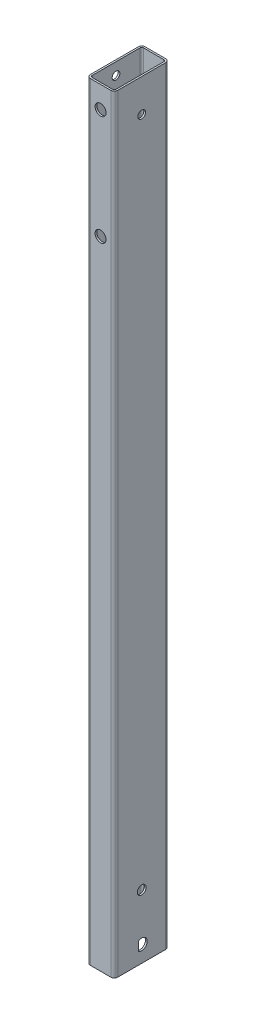
ISO-10303-21;
HEADER;
FILE_DESCRIPTION(('STEP AP214'),'2;1');
FILE_NAME('part.step','',(''),(''),'','','');
FILE_SCHEMA(('AUTOMOTIVE_DESIGN { 1 0 10303 214 1 1 1 1 }'));
ENDSEC;
DATA;
#1=APPLICATION_CONTEXT('core data for automotive mechanical design processes');
#2=APPLICATION_PROTOCOL_DEFINITION('international standard','automotive_design',2000,#1);
#3=PRODUCT_CONTEXT('',#1,'mechanical');
#4=PRODUCT('Part','Part','',(#3));
#5=PRODUCT_RELATED_PRODUCT_CATEGORY('part','',(#4));
#6=PRODUCT_DEFINITION_FORMATION('','',#4);
#7=PRODUCT_DEFINITION_CONTEXT('part definition',#1,'design');
#8=PRODUCT_DEFINITION('design','',#6,#7);
#9=PRODUCT_DEFINITION_SHAPE('','',#8);
#10=(LENGTH_UNIT() NAMED_UNIT(*) SI_UNIT(.MILLI.,.METRE.));
#11=(NAMED_UNIT(*) PLANE_ANGLE_UNIT() SI_UNIT($,.RADIAN.));
#12=(NAMED_UNIT(*) SI_UNIT($,.STERADIAN.) SOLID_ANGLE_UNIT());
#13=UNCERTAINTY_MEASURE_WITH_UNIT(LENGTH_MEASURE(1.E-05),#10,'distance_accuracy_value','');
#14=(GEOMETRIC_REPRESENTATION_CONTEXT(3) GLOBAL_UNCERTAINTY_ASSIGNED_CONTEXT((#13)) GLOBAL_UNIT_ASSIGNED_CONTEXT((#10,
#11,#12)) REPRESENTATION_CONTEXT('',''));
#15=CARTESIAN_POINT('',(0.,0.,0.));
#16=DIRECTION('',(0.,0.,1.));
#17=DIRECTION('',(1.,0.,0.));
#18=AXIS2_PLACEMENT_3D('',#15,#16,#17);
#19=CARTESIAN_POINT('',(12.5,0.,0.));
#20=DIRECTION('',(-1.,0.,0.));
#21=DIRECTION('',(0.,0.,-1.));
#22=AXIS2_PLACEMENT_3D('',#19,#20,#21);
#23=CYLINDRICAL_SURFACE('',#22,5.);
#24=CARTESIAN_POINT('',(-10.9,0.,0.));
#25=DIRECTION('',(1.,0.,0.));
#26=DIRECTION('',(0.,0.,-1.));
#27=AXIS2_PLACEMENT_3D('',#24,#25,#26);
#28=CIRCLE('',#27,5.);
#29=CARTESIAN_POINT('',(-10.9,-4.33012701892219,2.5));
#30=VERTEX_POINT('',#29);
#31=CARTESIAN_POINT('',(-10.9,4.33012701892219,2.5));
#32=VERTEX_POINT('',#31);
#33=EDGE_CURVE('E284',#30,#32,#28,.T.);
#34=ORIENTED_EDGE('',*,*,#33,.T.);
#35=DIRECTION('',(-1.,0.,0.));
#36=VECTOR('',#35,1.);
#37=CARTESIAN_POINT('',(12.5,4.33012701892219,2.5));
#38=LINE('',#37,#36);
#39=CARTESIAN_POINT('',(-12.5,4.33012701892219,2.5));
#40=VERTEX_POINT('',#39);
#41=EDGE_CURVE('E334',#40,#32,#38,.F.);
#42=ORIENTED_EDGE('',*,*,#41,.F.);
#43=CARTESIAN_POINT('',(-12.5,0.,0.));
#44=DIRECTION('',(-1.,0.,0.));
#45=DIRECTION('',(0.,0.,1.));
#46=AXIS2_PLACEMENT_3D('',#43,#44,#45);
#47=CIRCLE('',#46,5.);
#48=CARTESIAN_POINT('',(-12.5,-4.33012701892219,2.5));
#49=VERTEX_POINT('',#48);
#50=EDGE_CURVE('E295',#40,#49,#47,.T.);
#51=ORIENTED_EDGE('',*,*,#50,.T.);
#52=DIRECTION('',(-1.,0.,0.));
#53=VECTOR('',#52,1.);
#54=CARTESIAN_POINT('',(12.5,-4.33012701892219,2.5));
#55=LINE('',#54,#53);
#56=EDGE_CURVE('E337',#30,#49,#55,.T.);
#57=ORIENTED_EDGE('',*,*,#56,.F.);
#58=EDGE_LOOP('',(#34,#42,#51,#57));
#59=FACE_BOUND('',#58,.T.);
#60=ADVANCED_FACE('F41',(#59),#23,.F.);
#61=CARTESIAN_POINT('',(-20.7462112512353,4.,3.));
#62=DIRECTION('',(0.,0.,-1.));
#63=DIRECTION('',(1.,0.,0.));
#64=AXIS2_PLACEMENT_3D('',#61,#62,#63);
#65=PLANE('',#64);
#66=DIRECTION('',(0.,-1.,0.));
#67=VECTOR('',#66,1.);
#68=CARTESIAN_POINT('',(-10.9,4.,3.));
#69=LINE('',#68,#67);
#70=CARTESIAN_POINT('',(-10.9,3.46410161513775,3.));
#71=VERTEX_POINT('',#70);
#72=CARTESIAN_POINT('',(-10.9,-3.46410161513775,3.));
#73=VERTEX_POINT('',#72);
#74=EDGE_CURVE('E281',#71,#73,#69,.T.);
#75=ORIENTED_EDGE('',*,*,#74,.T.);
#76=DIRECTION('',(1.,0.,0.));
#77=VECTOR('',#76,1.);
#78=CARTESIAN_POINT('',(12.5,-3.46410161513775,3.));
#79=LINE('',#78,#77);
#80=CARTESIAN_POINT('',(-12.5,-3.46410161513775,3.));
#81=VERTEX_POINT('',#80);
#82=EDGE_CURVE('E330',#81,#73,#79,.T.);
#83=ORIENTED_EDGE('',*,*,#82,.F.);
#84=DIRECTION('',(0.,-1.,0.));
#85=VECTOR('',#84,1.);
#86=CARTESIAN_POINT('',(-12.5,4.,3.));
#87=LINE('',#86,#85);
#88=CARTESIAN_POINT('',(-12.5,3.46410161513775,3.));
#89=VERTEX_POINT('',#88);
#90=EDGE_CURVE('E292',#89,#81,#87,.T.);
#91=ORIENTED_EDGE('',*,*,#90,.F.);
#92=DIRECTION('',(1.,0.,0.));
#93=VECTOR('',#92,1.);
#94=CARTESIAN_POINT('',(-12.5,3.46410161513775,3.));
#95=LINE('',#94,#93);
#96=EDGE_CURVE('E325',#71,#89,#95,.F.);
#97=ORIENTED_EDGE('',*,*,#96,.F.);
#98=EDGE_LOOP('',(#75,#83,#91,#97));
#99=FACE_BOUND('',#98,.T.);
#100=ADVANCED_FACE('F429',(#99),#65,.T.);
#101=CARTESIAN_POINT('',(12.5,-3.46410161513775,2.));
#102=DIRECTION('',(-1.,0.,0.));
#103=DIRECTION('',(0.,0.,-1.));
#104=AXIS2_PLACEMENT_3D('',#101,#102,#103);
#105=CYLINDRICAL_SURFACE('',#104,1.);
#106=ORIENTED_EDGE('',*,*,#56,.T.);
#107=CARTESIAN_POINT('',(-12.5,-3.46410161513775,2.));
#108=DIRECTION('',(1.,0.,0.));
#109=DIRECTION('',(0.,0.,-1.));
#110=AXIS2_PLACEMENT_3D('',#107,#108,#109);
#111=CIRCLE('',#110,1.);
#112=EDGE_CURVE('E344',#49,#81,#111,.F.);
#113=ORIENTED_EDGE('',*,*,#112,.T.);
#114=ORIENTED_EDGE('',*,*,#82,.T.);
#115=CARTESIAN_POINT('',(-10.9,-3.46410161513775,2.));
#116=DIRECTION('',(1.,0.,0.));
#117=DIRECTION('',(0.,0.,-1.));
#118=AXIS2_PLACEMENT_3D('',#115,#116,#117);
#119=CIRCLE('',#118,1.);
#120=EDGE_CURVE('E287',#30,#73,#119,.F.);
#121=ORIENTED_EDGE('',*,*,#120,.F.);
#122=EDGE_LOOP('',(#106,#113,#114,#121));
#123=FACE_BOUND('',#122,.T.);
#124=ADVANCED_FACE('F422',(#123),#105,.F.);
#125=CARTESIAN_POINT('',(12.5,3.46410161513775,2.));
#126=DIRECTION('',(-1.,0.,0.));
#127=DIRECTION('',(0.,0.,-1.));
#128=AXIS2_PLACEMENT_3D('',#125,#126,#127);
#129=CYLINDRICAL_SURFACE('',#128,1.);
#130=ORIENTED_EDGE('',*,*,#96,.T.);
#131=CARTESIAN_POINT('',(-12.5,3.46410161513775,2.));
#132=DIRECTION('',(1.,0.,0.));
#133=DIRECTION('',(0.,0.,-1.));
#134=AXIS2_PLACEMENT_3D('',#131,#132,#133);
#135=CIRCLE('',#134,1.);
#136=EDGE_CURVE('E349',#89,#40,#135,.F.);
#137=ORIENTED_EDGE('',*,*,#136,.T.);
#138=ORIENTED_EDGE('',*,*,#41,.T.);
#139=CARTESIAN_POINT('',(-10.9,3.46410161513775,2.));
#140=DIRECTION('',(1.,0.,0.));
#141=DIRECTION('',(0.,0.,-1.));
#142=AXIS2_PLACEMENT_3D('',#139,#140,#141);
#143=CIRCLE('',#142,1.);
#144=EDGE_CURVE('E11',#71,#32,#143,.F.);
#145=ORIENTED_EDGE('',*,*,#144,.F.);
#146=EDGE_LOOP('',(#130,#137,#138,#145));
#147=FACE_BOUND('',#146,.T.);
#148=ADVANCED_FACE('F412',(#147),#129,.F.);
#149=CARTESIAN_POINT('',(12.5,0.,0.));
#150=DIRECTION('',(-1.,0.,0.));
#151=DIRECTION('',(0.,0.,-1.));
#152=AXIS2_PLACEMENT_3D('',#149,#150,#151);
#153=PLANE('',#152);
#154=CARTESIAN_POINT('',(12.5,655.,0.));
#155=DIRECTION('',(-1.,0.,0.));
#156=DIRECTION('',(0.,0.,1.));
#157=AXIS2_PLACEMENT_3D('',#154,#155,#156);
#158=CIRCLE('',#157,3.5);
#159=CARTESIAN_POINT('',(12.5,655.,3.5));
#160=VERTEX_POINT('',#159);
#161=EDGE_CURVE('E778',#160,#160,#158,.T.);
#162=ORIENTED_EDGE('',*,*,#161,.T.);
#163=EDGE_LOOP('',(#162));
#164=FACE_BOUND('',#163,.T.);
#165=CARTESIAN_POINT('',(12.5,43.,0.));
#166=DIRECTION('',(-1.,0.,0.));
#167=DIRECTION('',(0.,0.,1.));
#168=AXIS2_PLACEMENT_3D('',#165,#166,#167);
#169=CIRCLE('',#168,4.);
#170=CARTESIAN_POINT('',(12.5,43.,4.));
#171=VERTEX_POINT('',#170);
#172=EDGE_CURVE('E242',#171,#171,#169,.T.);
#173=ORIENTED_EDGE('',*,*,#172,.T.);
#174=EDGE_LOOP('',(#173));
#175=FACE_BOUND('',#174,.T.);
#176=DIRECTION('',(0.,0.,1.));
#177=VECTOR('',#176,1.);
#178=CARTESIAN_POINT('',(12.5,-15.,-25.));
#179=LINE('',#178,#177);
#180=CARTESIAN_POINT('',(12.5,-15.,-21.8));
#181=VERTEX_POINT('',#180);
#182=CARTESIAN_POINT('',(12.5,-15.,21.8));
#183=VERTEX_POINT('',#182);
#184=EDGE_CURVE('E305',#181,#183,#179,.T.);
#185=ORIENTED_EDGE('',*,*,#184,.F.);
#186=DIRECTION('',(0.,-1.,0.));
#187=VECTOR('',#186,1.);
#188=CARTESIAN_POINT('',(12.5,0.,-21.8));
#189=LINE('',#188,#187);
#190=CARTESIAN_POINT('',(12.5,685.,-21.8));
#191=VERTEX_POINT('',#190);
#192=EDGE_CURVE('E351',#191,#181,#189,.T.);
#193=ORIENTED_EDGE('',*,*,#192,.F.);
#194=DIRECTION('',(0.,0.,-1.));
#195=VECTOR('',#194,1.);
#196=CARTESIAN_POINT('',(12.5,685.,-25.));
#197=LINE('',#196,#195);
#198=CARTESIAN_POINT('',(12.5,685.,21.8));
#199=VERTEX_POINT('',#198);
#200=EDGE_CURVE('E302',#199,#191,#197,.T.);
#201=ORIENTED_EDGE('',*,*,#200,.F.);
#202=DIRECTION('',(0.,1.,0.));
#203=VECTOR('',#202,1.);
#204=CARTESIAN_POINT('',(12.5,0.,21.8));
#205=LINE('',#204,#203);
#206=EDGE_CURVE('E354',#183,#199,#205,.T.);
#207=ORIENTED_EDGE('',*,*,#206,.F.);
#208=EDGE_LOOP('',(#185,#193,#201,#207));
#209=FACE_BOUND('',#208,.T.);
#210=CARTESIAN_POINT('',(12.5,0.,0.));
#211=DIRECTION('',(-1.,0.,0.));
#212=DIRECTION('',(0.,0.,1.));
#213=AXIS2_PLACEMENT_3D('',#210,#211,#212);
#214=CIRCLE('',#213,5.);
#215=CARTESIAN_POINT('',(12.5,4.33012701892219,2.5));
#216=VERTEX_POINT('',#215);
#217=CARTESIAN_POINT('',(12.5,-4.33012701892219,2.5));
#218=VERTEX_POINT('',#217);
#219=EDGE_CURVE('E296',#216,#218,#214,.T.);
#220=ORIENTED_EDGE('',*,*,#219,.T.);
#221=CARTESIAN_POINT('',(12.5,-3.46410161513775,2.));
#222=DIRECTION('',(1.,0.,0.));
#223=DIRECTION('',(0.,0.,-1.));
#224=AXIS2_PLACEMENT_3D('',#221,#222,#223);
#225=CIRCLE('',#224,1.);
#226=CARTESIAN_POINT('',(12.5,-3.46410161513775,3.));
#227=VERTEX_POINT('',#226);
#228=EDGE_CURVE('E341',#227,#218,#225,.T.);
#229=ORIENTED_EDGE('',*,*,#228,.F.);
#230=DIRECTION('',(0.,-1.,0.));
#231=VECTOR('',#230,1.);
#232=CARTESIAN_POINT('',(12.5,4.,3.));
#233=LINE('',#232,#231);
#234=CARTESIAN_POINT('',(12.5,3.46410161513775,3.));
#235=VERTEX_POINT('',#234);
#236=EDGE_CURVE('E289',#235,#227,#233,.T.);
#237=ORIENTED_EDGE('',*,*,#236,.F.);
#238=CARTESIAN_POINT('',(12.5,3.46410161513775,2.));
#239=DIRECTION('',(1.,0.,0.));
#240=DIRECTION('',(0.,0.,-1.));
#241=AXIS2_PLACEMENT_3D('',#238,#239,#240);
#242=CIRCLE('',#241,1.);
#243=EDGE_CURVE('E346',#216,#235,#242,.T.);
#244=ORIENTED_EDGE('',*,*,#243,.F.);
#245=EDGE_LOOP('',(#220,#229,#237,#244));
#246=FACE_BOUND('',#245,.T.);
#247=ADVANCED_FACE('F409',(#164,#175,#209,#246),#153,.F.);
#248=CARTESIAN_POINT('',(-12.5,0.,0.));
#249=DIRECTION('',(-1.,0.,0.));
#250=DIRECTION('',(0.,0.,-1.));
#251=AXIS2_PLACEMENT_3D('',#248,#249,#250);
#252=PLANE('',#251);
#253=CARTESIAN_POINT('',(-12.5,674.,0.));
#254=DIRECTION('',(1.,0.,0.));
#255=DIRECTION('',(0.,0.,-1.));
#256=AXIS2_PLACEMENT_3D('',#253,#254,#255);
#257=CIRCLE('',#256,3.5);
#258=CARTESIAN_POINT('',(-12.5,674.,-3.5));
#259=VERTEX_POINT('',#258);
#260=EDGE_CURVE('E751',#259,#259,#257,.T.);
#261=ORIENTED_EDGE('',*,*,#260,.T.);
#262=EDGE_LOOP('',(#261));
#263=FACE_BOUND('',#262,.T.);
#264=CARTESIAN_POINT('',(-12.5,656.,0.));
#265=DIRECTION('',(1.,0.,0.));
#266=DIRECTION('',(0.,0.,-1.));
#267=AXIS2_PLACEMENT_3D('',#264,#265,#266);
#268=CIRCLE('',#267,3.5);
#269=CARTESIAN_POINT('',(-12.5,656.,-3.5));
#270=VERTEX_POINT('',#269);
#271=EDGE_CURVE('E759',#270,#270,#268,.T.);
#272=ORIENTED_EDGE('',*,*,#271,.T.);
#273=EDGE_LOOP('',(#272));
#274=FACE_BOUND('',#273,.T.);
#275=DIRECTION('',(0.,0.,-1.));
#276=VECTOR('',#275,1.);
#277=CARTESIAN_POINT('',(-12.5,685.,-25.));
#278=LINE('',#277,#276);
#279=CARTESIAN_POINT('',(-12.5,685.,21.8));
#280=VERTEX_POINT('',#279);
#281=CARTESIAN_POINT('',(-12.5,685.,-21.8));
#282=VERTEX_POINT('',#281);
#283=EDGE_CURVE('E299',#280,#282,#278,.T.);
#284=ORIENTED_EDGE('',*,*,#283,.T.);
#285=DIRECTION('',(0.,-1.,0.));
#286=VECTOR('',#285,1.);
#287=CARTESIAN_POINT('',(-12.5,685.,-21.8));
#288=LINE('',#287,#286);
#289=CARTESIAN_POINT('',(-12.5,-15.,-21.8));
#290=VERTEX_POINT('',#289);
#291=EDGE_CURVE('E380',#290,#282,#288,.F.);
#292=ORIENTED_EDGE('',*,*,#291,.F.);
#293=DIRECTION('',(0.,0.,1.));
#294=VECTOR('',#293,1.);
#295=CARTESIAN_POINT('',(-12.5,-15.,-25.));
#296=LINE('',#295,#294);
#297=CARTESIAN_POINT('',(-12.5,-15.,21.8));
#298=VERTEX_POINT('',#297);
#299=EDGE_CURVE('E306',#290,#298,#296,.T.);
#300=ORIENTED_EDGE('',*,*,#299,.T.);
#301=DIRECTION('',(0.,1.,0.));
#302=VECTOR('',#301,1.);
#303=CARTESIAN_POINT('',(-12.5,-15.,21.8));
#304=LINE('',#303,#302);
#305=EDGE_CURVE('E383',#280,#298,#304,.F.);
#306=ORIENTED_EDGE('',*,*,#305,.F.);
#307=EDGE_LOOP('',(#284,#292,#300,#306));
#308=FACE_BOUND('',#307,.T.);
#309=ORIENTED_EDGE('',*,*,#90,.T.);
#310=ORIENTED_EDGE('',*,*,#112,.F.);
#311=ORIENTED_EDGE('',*,*,#50,.F.);
#312=ORIENTED_EDGE('',*,*,#136,.F.);
#313=EDGE_LOOP('',(#309,#310,#311,#312));
#314=FACE_BOUND('',#313,.T.);
#315=ADVANCED_FACE('F411',(#263,#274,#308,#314),#252,.T.);
#316=CARTESIAN_POINT('',(12.5,-15.,25.));
#317=DIRECTION('',(0.,0.,-1.));
#318=DIRECTION('',(1.,0.,0.));
#319=AXIS2_PLACEMENT_3D('',#316,#317,#318);
#320=PLANE('',#319);
#321=CARTESIAN_POINT('',(0.,665.,25.));
#322=DIRECTION('',(0.,0.,-1.));
#323=DIRECTION('',(-1.,0.,0.));
#324=AXIS2_PLACEMENT_3D('',#321,#322,#323);
#325=CIRCLE('',#324,5.);
#326=CARTESIAN_POINT('',(-5.,665.,25.));
#327=VERTEX_POINT('',#326);
#328=EDGE_CURVE('E770',#327,#327,#325,.T.);
#329=ORIENTED_EDGE('',*,*,#328,.T.);
#330=EDGE_LOOP('',(#329));
#331=FACE_BOUND('',#330,.T.);
#332=CARTESIAN_POINT('',(0.,565.,25.));
#333=DIRECTION('',(0.,0.,-1.));
#334=DIRECTION('',(-1.,0.,0.));
#335=AXIS2_PLACEMENT_3D('',#332,#333,#334);
#336=CIRCLE('',#335,5.);
#337=CARTESIAN_POINT('',(-5.00000000000002,565.,25.));
#338=VERTEX_POINT('',#337);
#339=EDGE_CURVE('E754',#338,#338,#336,.T.);
#340=ORIENTED_EDGE('',*,*,#339,.T.);
#341=EDGE_LOOP('',(#340));
#342=FACE_BOUND('',#341,.T.);
#343=DIRECTION('',(-1.,0.,0.));
#344=VECTOR('',#343,1.);
#345=CARTESIAN_POINT('',(12.5,685.,25.));
#346=LINE('',#345,#344);
#347=CARTESIAN_POINT('',(9.3,685.,25.));
#348=VERTEX_POINT('',#347);
#349=CARTESIAN_POINT('',(-9.3,685.,25.));
#350=VERTEX_POINT('',#349);
#351=EDGE_CURVE('E322',#348,#350,#346,.T.);
#352=ORIENTED_EDGE('',*,*,#351,.T.);
#353=DIRECTION('',(0.,1.,0.));
#354=VECTOR('',#353,1.);
#355=CARTESIAN_POINT('',(-9.3,685.,25.));
#356=LINE('',#355,#354);
#357=CARTESIAN_POINT('',(-9.3,-15.,25.));
#358=VERTEX_POINT('',#357);
#359=EDGE_CURVE('E366',#358,#350,#356,.T.);
#360=ORIENTED_EDGE('',*,*,#359,.F.);
#361=DIRECTION('',(-1.,0.,0.));
#362=VECTOR('',#361,1.);
#363=CARTESIAN_POINT('',(12.5,-15.,25.));
#364=LINE('',#363,#362);
#365=CARTESIAN_POINT('',(9.3,-15.,25.));
#366=VERTEX_POINT('',#365);
#367=EDGE_CURVE('E309',#366,#358,#364,.T.);
#368=ORIENTED_EDGE('',*,*,#367,.F.);
#369=DIRECTION('',(0.,1.,0.));
#370=VECTOR('',#369,1.);
#371=CARTESIAN_POINT('',(9.3,-15.,25.));
#372=LINE('',#371,#370);
#373=EDGE_CURVE('E369',#348,#366,#372,.F.);
#374=ORIENTED_EDGE('',*,*,#373,.F.);
#375=EDGE_LOOP('',(#352,#360,#368,#374));
#376=FACE_BOUND('',#375,.T.);
#377=ADVANCED_FACE('F419',(#331,#342,#376),#320,.F.);
#378=CARTESIAN_POINT('',(12.5,685.,-25.));
#379=DIRECTION('',(0.,-1.,0.));
#380=DIRECTION('',(0.,0.,1.));
#381=AXIS2_PLACEMENT_3D('',#378,#379,#380);
#382=PLANE('',#381);
#383=DIRECTION('',(0.,0.,1.));
#384=VECTOR('',#383,1.);
#385=CARTESIAN_POINT('',(-10.9,685.,-21.8));
#386=LINE('',#385,#384);
#387=CARTESIAN_POINT('',(-10.9,685.,-21.8));
#388=VERTEX_POINT('',#387);
#389=CARTESIAN_POINT('',(-10.9,685.,21.8));
#390=VERTEX_POINT('',#389);
#391=EDGE_CURVE('E208',#388,#390,#386,.T.);
#392=ORIENTED_EDGE('',*,*,#391,.F.);
#393=CARTESIAN_POINT('',(-9.3,685.,-21.8));
#394=DIRECTION('',(0.,1.,0.));
#395=DIRECTION('',(0.,0.,1.));
#396=AXIS2_PLACEMENT_3D('',#393,#394,#395);
#397=CIRCLE('',#396,1.6);
#398=CARTESIAN_POINT('',(-9.3,685.,-23.4));
#399=VERTEX_POINT('',#398);
#400=EDGE_CURVE('E236',#399,#388,#397,.T.);
#401=ORIENTED_EDGE('',*,*,#400,.F.);
#402=DIRECTION('',(-1.,0.,0.));
#403=VECTOR('',#402,1.);
#404=CARTESIAN_POINT('',(9.3,685.,-23.4));
#405=LINE('',#404,#403);
#406=CARTESIAN_POINT('',(9.3,685.,-23.4));
#407=VERTEX_POINT('',#406);
#408=EDGE_CURVE('E233',#407,#399,#405,.T.);
#409=ORIENTED_EDGE('',*,*,#408,.F.);
#410=CARTESIAN_POINT('',(9.3,685.,-21.8));
#411=DIRECTION('',(0.,1.,0.));
#412=DIRECTION('',(0.,0.,1.));
#413=AXIS2_PLACEMENT_3D('',#410,#411,#412);
#414=CIRCLE('',#413,1.6);
#415=CARTESIAN_POINT('',(10.9,685.,-21.8));
#416=VERTEX_POINT('',#415);
#417=EDGE_CURVE('E230',#416,#407,#414,.T.);
#418=ORIENTED_EDGE('',*,*,#417,.F.);
#419=DIRECTION('',(0.,0.,-1.));
#420=VECTOR('',#419,1.);
#421=CARTESIAN_POINT('',(10.9,685.,21.8));
#422=LINE('',#421,#420);
#423=CARTESIAN_POINT('',(10.9,685.,21.8));
#424=VERTEX_POINT('',#423);
#425=EDGE_CURVE('E224',#424,#416,#422,.T.);
#426=ORIENTED_EDGE('',*,*,#425,.F.);
#427=CARTESIAN_POINT('',(9.3,685.,21.8));
#428=DIRECTION('',(0.,1.,0.));
#429=DIRECTION('',(0.,0.,1.));
#430=AXIS2_PLACEMENT_3D('',#427,#428,#429);
#431=CIRCLE('',#430,1.6);
#432=CARTESIAN_POINT('',(9.3,685.,23.4));
#433=VERTEX_POINT('',#432);
#434=EDGE_CURVE('E222',#433,#424,#431,.T.);
#435=ORIENTED_EDGE('',*,*,#434,.F.);
#436=DIRECTION('',(1.,0.,0.));
#437=VECTOR('',#436,1.);
#438=CARTESIAN_POINT('',(-9.3,685.,23.4));
#439=LINE('',#438,#437);
#440=CARTESIAN_POINT('',(-9.3,685.,23.4));
#441=VERTEX_POINT('',#440);
#442=EDGE_CURVE('E204',#441,#433,#439,.T.);
#443=ORIENTED_EDGE('',*,*,#442,.F.);
#444=CARTESIAN_POINT('',(-9.3,685.,21.8));
#445=DIRECTION('',(0.,1.,0.));
#446=DIRECTION('',(0.,0.,1.));
#447=AXIS2_PLACEMENT_3D('',#444,#445,#446);
#448=CIRCLE('',#447,1.6);
#449=EDGE_CURVE('E211',#390,#441,#448,.T.);
#450=ORIENTED_EDGE('',*,*,#449,.F.);
#451=EDGE_LOOP('',(#392,#401,#409,#418,#426,#435,#443,#450));
#452=FACE_BOUND('',#451,.T.);
#453=ORIENTED_EDGE('',*,*,#200,.T.);
#454=CARTESIAN_POINT('',(9.3,685.,-21.8));
#455=DIRECTION('',(0.,1.,0.));
#456=DIRECTION('',(0.,0.,1.));
#457=AXIS2_PLACEMENT_3D('',#454,#455,#456);
#458=CIRCLE('',#457,3.2);
#459=CARTESIAN_POINT('',(9.3,685.,-25.));
#460=VERTEX_POINT('',#459);
#461=EDGE_CURVE('E360',#460,#191,#458,.F.);
#462=ORIENTED_EDGE('',*,*,#461,.F.);
#463=DIRECTION('',(-1.,0.,0.));
#464=VECTOR('',#463,1.);
#465=CARTESIAN_POINT('',(12.5,685.,-25.));
#466=LINE('',#465,#464);
#467=CARTESIAN_POINT('',(-9.3,685.,-25.));
#468=VERTEX_POINT('',#467);
#469=EDGE_CURVE('E319',#460,#468,#466,.T.);
#470=ORIENTED_EDGE('',*,*,#469,.T.);
#471=CARTESIAN_POINT('',(-9.3,685.,-21.8));
#472=DIRECTION('',(0.,1.,0.));
#473=DIRECTION('',(0.,0.,1.));
#474=AXIS2_PLACEMENT_3D('',#471,#472,#473);
#475=CIRCLE('',#474,3.2);
#476=EDGE_CURVE('E357',#282,#468,#475,.F.);
#477=ORIENTED_EDGE('',*,*,#476,.F.);
#478=ORIENTED_EDGE('',*,*,#283,.F.);
#479=CARTESIAN_POINT('',(-9.3,685.,21.8));
#480=DIRECTION('',(0.,1.,0.));
#481=DIRECTION('',(0.,0.,1.));
#482=AXIS2_PLACEMENT_3D('',#479,#480,#481);
#483=CIRCLE('',#482,3.2);
#484=EDGE_CURVE('E362',#350,#280,#483,.F.);
#485=ORIENTED_EDGE('',*,*,#484,.F.);
#486=ORIENTED_EDGE('',*,*,#351,.F.);
#487=CARTESIAN_POINT('',(9.3,685.,21.8));
#488=DIRECTION('',(0.,1.,0.));
#489=DIRECTION('',(0.,0.,1.));
#490=AXIS2_PLACEMENT_3D('',#487,#488,#489);
#491=CIRCLE('',#490,3.2);
#492=EDGE_CURVE('E364',#199,#348,#491,.F.);
#493=ORIENTED_EDGE('',*,*,#492,.F.);
#494=EDGE_LOOP('',(#453,#462,#470,#477,#478,#485,#486,#493));
#495=FACE_BOUND('',#494,.T.);
#496=ADVANCED_FACE('F219',(#452,#495),#382,.F.);
#497=CARTESIAN_POINT('',(12.5,-15.,-25.));
#498=DIRECTION('',(0.,0.,1.));
#499=DIRECTION('',(-1.,0.,0.));
#500=AXIS2_PLACEMENT_3D('',#497,#498,#499);
#501=PLANE('',#500);
#502=DIRECTION('',(-1.,0.,0.));
#503=VECTOR('',#502,1.);
#504=CARTESIAN_POINT('',(12.5,-15.,-25.));
#505=LINE('',#504,#503);
#506=CARTESIAN_POINT('',(9.3,-15.,-25.));
#507=VERTEX_POINT('',#506);
#508=CARTESIAN_POINT('',(-9.3,-15.,-25.));
#509=VERTEX_POINT('',#508);
#510=EDGE_CURVE('E316',#507,#509,#505,.T.);
#511=ORIENTED_EDGE('',*,*,#510,.T.);
#512=DIRECTION('',(0.,-1.,0.));
#513=VECTOR('',#512,1.);
#514=CARTESIAN_POINT('',(-9.3,-15.,-25.));
#515=LINE('',#514,#513);
#516=EDGE_CURVE('E386',#468,#509,#515,.T.);
#517=ORIENTED_EDGE('',*,*,#516,.F.);
#518=ORIENTED_EDGE('',*,*,#469,.F.);
#519=DIRECTION('',(0.,-1.,0.));
#520=VECTOR('',#519,1.);
#521=CARTESIAN_POINT('',(9.3,-15.,-25.));
#522=LINE('',#521,#520);
#523=EDGE_CURVE('E389',#507,#460,#522,.F.);
#524=ORIENTED_EDGE('',*,*,#523,.F.);
#525=EDGE_LOOP('',(#511,#517,#518,#524));
#526=FACE_BOUND('',#525,.T.);
#527=ADVANCED_FACE('F442',(#526),#501,.F.);
#528=CARTESIAN_POINT('',(12.5,-15.,-25.));
#529=DIRECTION('',(0.,1.,0.));
#530=DIRECTION('',(0.,0.,-1.));
#531=AXIS2_PLACEMENT_3D('',#528,#529,#530);
#532=PLANE('',#531);
#533=DIRECTION('',(1.,0.,0.));
#534=VECTOR('',#533,1.);
#535=CARTESIAN_POINT('',(-9.3,-15.,23.4));
#536=LINE('',#535,#534);
#537=CARTESIAN_POINT('',(-9.3,-15.,23.4));
#538=VERTEX_POINT('',#537);
#539=CARTESIAN_POINT('',(9.3,-15.,23.4));
#540=VERTEX_POINT('',#539);
#541=EDGE_CURVE('E207',#538,#540,#536,.T.);
#542=ORIENTED_EDGE('',*,*,#541,.T.);
#543=CARTESIAN_POINT('',(9.3,-15.,21.8));
#544=DIRECTION('',(0.,1.,0.));
#545=DIRECTION('',(0.,0.,1.));
#546=AXIS2_PLACEMENT_3D('',#543,#544,#545);
#547=CIRCLE('',#546,1.6);
#548=CARTESIAN_POINT('',(10.9,-15.,21.8));
#549=VERTEX_POINT('',#548);
#550=EDGE_CURVE('E244',#540,#549,#547,.T.);
#551=ORIENTED_EDGE('',*,*,#550,.T.);
#552=DIRECTION('',(0.,0.,-1.));
#553=VECTOR('',#552,1.);
#554=CARTESIAN_POINT('',(10.9,-15.,21.8));
#555=LINE('',#554,#553);
#556=CARTESIAN_POINT('',(10.9,-15.,-21.8));
#557=VERTEX_POINT('',#556);
#558=EDGE_CURVE('E247',#549,#557,#555,.T.);
#559=ORIENTED_EDGE('',*,*,#558,.T.);
#560=CARTESIAN_POINT('',(9.3,-15.,-21.8));
#561=DIRECTION('',(0.,1.,0.));
#562=DIRECTION('',(0.,0.,1.));
#563=AXIS2_PLACEMENT_3D('',#560,#561,#562);
#564=CIRCLE('',#563,1.6);
#565=CARTESIAN_POINT('',(9.3,-15.,-23.4));
#566=VERTEX_POINT('',#565);
#567=EDGE_CURVE('E250',#557,#566,#564,.T.);
#568=ORIENTED_EDGE('',*,*,#567,.T.);
#569=DIRECTION('',(-1.,0.,0.));
#570=VECTOR('',#569,1.);
#571=CARTESIAN_POINT('',(9.3,-15.,-23.4));
#572=LINE('',#571,#570);
#573=CARTESIAN_POINT('',(-9.3,-15.,-23.4));
#574=VERTEX_POINT('',#573);
#575=EDGE_CURVE('E253',#566,#574,#572,.T.);
#576=ORIENTED_EDGE('',*,*,#575,.T.);
#577=CARTESIAN_POINT('',(-9.3,-15.,-21.8));
#578=DIRECTION('',(0.,1.,0.));
#579=DIRECTION('',(0.,0.,1.));
#580=AXIS2_PLACEMENT_3D('',#577,#578,#579);
#581=CIRCLE('',#580,1.6);
#582=CARTESIAN_POINT('',(-10.9,-15.,-21.8));
#583=VERTEX_POINT('',#582);
#584=EDGE_CURVE('E256',#574,#583,#581,.T.);
#585=ORIENTED_EDGE('',*,*,#584,.T.);
#586=DIRECTION('',(0.,0.,1.));
#587=VECTOR('',#586,1.);
#588=CARTESIAN_POINT('',(-10.9,-15.,-21.8));
#589=LINE('',#588,#587);
#590=CARTESIAN_POINT('',(-10.9,-15.,21.8));
#591=VERTEX_POINT('',#590);
#592=EDGE_CURVE('E217',#583,#591,#589,.T.);
#593=ORIENTED_EDGE('',*,*,#592,.T.);
#594=CARTESIAN_POINT('',(-9.3,-15.,21.8));
#595=DIRECTION('',(0.,1.,0.));
#596=DIRECTION('',(0.,0.,1.));
#597=AXIS2_PLACEMENT_3D('',#594,#595,#596);
#598=CIRCLE('',#597,1.6);
#599=EDGE_CURVE('E240',#591,#538,#598,.T.);
#600=ORIENTED_EDGE('',*,*,#599,.T.);
#601=EDGE_LOOP('',(#542,#551,#559,#568,#576,#585,#593,#600));
#602=FACE_BOUND('',#601,.T.);
#603=ORIENTED_EDGE('',*,*,#367,.T.);
#604=CARTESIAN_POINT('',(-9.3,-15.,21.8));
#605=DIRECTION('',(0.,-1.,0.));
#606=DIRECTION('',(0.,0.,-1.));
#607=AXIS2_PLACEMENT_3D('',#604,#605,#606);
#608=CIRCLE('',#607,3.2);
#609=EDGE_CURVE('E376',#298,#358,#608,.F.);
#610=ORIENTED_EDGE('',*,*,#609,.F.);
#611=ORIENTED_EDGE('',*,*,#299,.F.);
#612=CARTESIAN_POINT('',(-9.3,-15.,-21.8));
#613=DIRECTION('',(0.,-1.,0.));
#614=DIRECTION('',(0.,0.,-1.));
#615=AXIS2_PLACEMENT_3D('',#612,#613,#614);
#616=CIRCLE('',#615,3.2);
#617=EDGE_CURVE('E372',#509,#290,#616,.F.);
#618=ORIENTED_EDGE('',*,*,#617,.F.);
#619=ORIENTED_EDGE('',*,*,#510,.F.);
#620=CARTESIAN_POINT('',(9.3,-15.,-21.8));
#621=DIRECTION('',(0.,-1.,0.));
#622=DIRECTION('',(0.,0.,-1.));
#623=AXIS2_PLACEMENT_3D('',#620,#621,#622);
#624=CIRCLE('',#623,3.2);
#625=EDGE_CURVE('E374',#181,#507,#624,.F.);
#626=ORIENTED_EDGE('',*,*,#625,.F.);
#627=ORIENTED_EDGE('',*,*,#184,.T.);
#628=CARTESIAN_POINT('',(9.3,-15.,21.8));
#629=DIRECTION('',(0.,-1.,0.));
#630=DIRECTION('',(0.,0.,-1.));
#631=AXIS2_PLACEMENT_3D('',#628,#629,#630);
#632=CIRCLE('',#631,3.2);
#633=EDGE_CURVE('E378',#366,#183,#632,.F.);
#634=ORIENTED_EDGE('',*,*,#633,.F.);
#635=EDGE_LOOP('',(#603,#610,#611,#618,#619,#626,#627,#634));
#636=FACE_BOUND('',#635,.T.);
#637=ADVANCED_FACE('F437',(#602,#636),#532,.F.);
#638=CARTESIAN_POINT('',(10.9,0.,0.));
#639=DIRECTION('',(-1.,0.,0.));
#640=DIRECTION('',(0.,0.,1.));
#641=AXIS2_PLACEMENT_3D('',#638,#639,#640);
#642=CIRCLE('',#641,5.);
#643=CARTESIAN_POINT('',(10.9,4.33012701892219,2.5));
#644=VERTEX_POINT('',#643);
#645=CARTESIAN_POINT('',(10.9,-4.33012701892219,2.5));
#646=VERTEX_POINT('',#645);
#647=EDGE_CURVE('E276',#644,#646,#642,.T.);
#648=ORIENTED_EDGE('',*,*,#647,.T.);
#649=EDGE_CURVE('E338',#218,#646,#55,.T.);
#650=ORIENTED_EDGE('',*,*,#649,.F.);
#651=ORIENTED_EDGE('',*,*,#219,.F.);
#652=EDGE_CURVE('E333',#644,#216,#38,.F.);
#653=ORIENTED_EDGE('',*,*,#652,.F.);
#654=EDGE_LOOP('',(#648,#650,#651,#653));
#655=FACE_BOUND('',#654,.T.);
#656=ADVANCED_FACE('F407',(#655),#23,.F.);
#657=DIRECTION('',(0.,1.,0.));
#658=VECTOR('',#657,1.);
#659=CARTESIAN_POINT('',(10.9,4.,3.));
#660=LINE('',#659,#658);
#661=CARTESIAN_POINT('',(10.9,-3.46410161513775,3.));
#662=VERTEX_POINT('',#661);
#663=CARTESIAN_POINT('',(10.9,3.46410161513775,3.));
#664=VERTEX_POINT('',#663);
#665=EDGE_CURVE('E262',#662,#664,#660,.T.);
#666=ORIENTED_EDGE('',*,*,#665,.T.);
#667=EDGE_CURVE('E326',#235,#664,#95,.F.);
#668=ORIENTED_EDGE('',*,*,#667,.F.);
#669=ORIENTED_EDGE('',*,*,#236,.T.);
#670=EDGE_CURVE('E329',#662,#227,#79,.T.);
#671=ORIENTED_EDGE('',*,*,#670,.F.);
#672=EDGE_LOOP('',(#666,#668,#669,#671));
#673=FACE_BOUND('',#672,.T.);
#674=ADVANCED_FACE('F401',(#673),#65,.T.);
#675=ORIENTED_EDGE('',*,*,#670,.T.);
#676=ORIENTED_EDGE('',*,*,#228,.T.);
#677=ORIENTED_EDGE('',*,*,#649,.T.);
#678=CARTESIAN_POINT('',(10.9,-3.46410161513775,2.));
#679=DIRECTION('',(-1.,0.,0.));
#680=DIRECTION('',(0.,0.,1.));
#681=AXIS2_PLACEMENT_3D('',#678,#679,#680);
#682=CIRCLE('',#681,1.);
#683=EDGE_CURVE('E279',#662,#646,#682,.F.);
#684=ORIENTED_EDGE('',*,*,#683,.F.);
#685=EDGE_LOOP('',(#675,#676,#677,#684));
#686=FACE_BOUND('',#685,.T.);
#687=ADVANCED_FACE('F404',(#686),#105,.F.);
#688=ORIENTED_EDGE('',*,*,#652,.T.);
#689=ORIENTED_EDGE('',*,*,#243,.T.);
#690=ORIENTED_EDGE('',*,*,#667,.T.);
#691=CARTESIAN_POINT('',(10.9,3.46410161513775,2.));
#692=DIRECTION('',(-1.,0.,0.));
#693=DIRECTION('',(0.,0.,1.));
#694=AXIS2_PLACEMENT_3D('',#691,#692,#693);
#695=CIRCLE('',#694,1.);
#696=EDGE_CURVE('E49',#644,#664,#695,.F.);
#697=ORIENTED_EDGE('',*,*,#696,.F.);
#698=EDGE_LOOP('',(#688,#689,#690,#697));
#699=FACE_BOUND('',#698,.T.);
#700=ADVANCED_FACE('F396',(#699),#129,.F.);
#701=CARTESIAN_POINT('',(9.3,0.,21.8));
#702=DIRECTION('',(0.,1.,0.));
#703=DIRECTION('',(0.,0.,-1.));
#704=AXIS2_PLACEMENT_3D('',#701,#702,#703);
#705=CYLINDRICAL_SURFACE('',#704,3.2);
#706=ORIENTED_EDGE('',*,*,#633,.T.);
#707=ORIENTED_EDGE('',*,*,#206,.T.);
#708=ORIENTED_EDGE('',*,*,#492,.T.);
#709=ORIENTED_EDGE('',*,*,#373,.T.);
#710=EDGE_LOOP('',(#706,#707,#708,#709));
#711=FACE_BOUND('',#710,.T.);
#712=ADVANCED_FACE('F460',(#711),#705,.T.);
#713=CARTESIAN_POINT('',(-9.3,-15.,21.8));
#714=DIRECTION('',(0.,-1.,0.));
#715=DIRECTION('',(0.,0.,1.));
#716=AXIS2_PLACEMENT_3D('',#713,#714,#715);
#717=CYLINDRICAL_SURFACE('',#716,3.2);
#718=ORIENTED_EDGE('',*,*,#609,.T.);
#719=ORIENTED_EDGE('',*,*,#359,.T.);
#720=ORIENTED_EDGE('',*,*,#484,.T.);
#721=ORIENTED_EDGE('',*,*,#305,.T.);
#722=EDGE_LOOP('',(#718,#719,#720,#721));
#723=FACE_BOUND('',#722,.T.);
#724=ADVANCED_FACE('F463',(#723),#717,.T.);
#725=CARTESIAN_POINT('',(9.3,0.,-21.8));
#726=DIRECTION('',(0.,-1.,0.));
#727=DIRECTION('',(0.,0.,1.));
#728=AXIS2_PLACEMENT_3D('',#725,#726,#727);
#729=CYLINDRICAL_SURFACE('',#728,3.2);
#730=ORIENTED_EDGE('',*,*,#461,.T.);
#731=ORIENTED_EDGE('',*,*,#192,.T.);
#732=ORIENTED_EDGE('',*,*,#625,.T.);
#733=ORIENTED_EDGE('',*,*,#523,.T.);
#734=EDGE_LOOP('',(#730,#731,#732,#733));
#735=FACE_BOUND('',#734,.T.);
#736=ADVANCED_FACE('F466',(#735),#729,.T.);
#737=CARTESIAN_POINT('',(-9.3,-15.,-21.8));
#738=DIRECTION('',(0.,1.,0.));
#739=DIRECTION('',(0.,0.,-1.));
#740=AXIS2_PLACEMENT_3D('',#737,#738,#739);
#741=CYLINDRICAL_SURFACE('',#740,3.2);
#742=ORIENTED_EDGE('',*,*,#476,.T.);
#743=ORIENTED_EDGE('',*,*,#516,.T.);
#744=ORIENTED_EDGE('',*,*,#617,.T.);
#745=ORIENTED_EDGE('',*,*,#291,.T.);
#746=EDGE_LOOP('',(#742,#743,#744,#745));
#747=FACE_BOUND('',#746,.T.);
#748=ADVANCED_FACE('F43',(#747),#741,.T.);
#749=CARTESIAN_POINT('',(-10.9,685.,-21.8));
#750=DIRECTION('',(-1.,0.,0.));
#751=DIRECTION('',(0.,0.,-1.));
#752=AXIS2_PLACEMENT_3D('',#749,#750,#751);
#753=PLANE('',#752);
#754=CARTESIAN_POINT('',(-10.9,674.,0.));
#755=DIRECTION('',(1.,0.,0.));
#756=DIRECTION('',(0.,0.,-1.));
#757=AXIS2_PLACEMENT_3D('',#754,#755,#756);
#758=CIRCLE('',#757,3.5);
#759=CARTESIAN_POINT('',(-10.9,674.,-3.5));
#760=VERTEX_POINT('',#759);
#761=EDGE_CURVE('E753',#760,#760,#758,.F.);
#762=ORIENTED_EDGE('',*,*,#761,.T.);
#763=EDGE_LOOP('',(#762));
#764=FACE_BOUND('',#763,.T.);
#765=CARTESIAN_POINT('',(-10.9,656.,0.));
#766=DIRECTION('',(1.,0.,0.));
#767=DIRECTION('',(0.,0.,-1.));
#768=AXIS2_PLACEMENT_3D('',#765,#766,#767);
#769=CIRCLE('',#768,3.5);
#770=CARTESIAN_POINT('',(-10.9,656.,-3.5));
#771=VERTEX_POINT('',#770);
#772=EDGE_CURVE('E764',#771,#771,#769,.F.);
#773=ORIENTED_EDGE('',*,*,#772,.T.);
#774=EDGE_LOOP('',(#773));
#775=FACE_BOUND('',#774,.T.);
#776=ORIENTED_EDGE('',*,*,#592,.F.);
#777=DIRECTION('',(0.,-1.,0.));
#778=VECTOR('',#777,1.);
#779=CARTESIAN_POINT('',(-10.9,685.,-21.8));
#780=LINE('',#779,#778);
#781=EDGE_CURVE('E263',#388,#583,#780,.T.);
#782=ORIENTED_EDGE('',*,*,#781,.F.);
#783=ORIENTED_EDGE('',*,*,#391,.T.);
#784=DIRECTION('',(0.,-1.,0.));
#785=VECTOR('',#784,1.);
#786=CARTESIAN_POINT('',(-10.9,685.,21.8));
#787=LINE('',#786,#785);
#788=EDGE_CURVE('E213',#390,#591,#787,.T.);
#789=ORIENTED_EDGE('',*,*,#788,.T.);
#790=EDGE_LOOP('',(#776,#782,#783,#789));
#791=FACE_BOUND('',#790,.T.);
#792=ORIENTED_EDGE('',*,*,#33,.F.);
#793=ORIENTED_EDGE('',*,*,#120,.T.);
#794=ORIENTED_EDGE('',*,*,#74,.F.);
#795=ORIENTED_EDGE('',*,*,#144,.T.);
#796=EDGE_LOOP('',(#792,#793,#794,#795));
#797=FACE_BOUND('',#796,.T.);
#798=ADVANCED_FACE('F473',(#764,#775,#791,#797),#753,.F.);
#799=CARTESIAN_POINT('',(10.9,685.,21.8));
#800=DIRECTION('',(1.,0.,0.));
#801=DIRECTION('',(0.,0.,1.));
#802=AXIS2_PLACEMENT_3D('',#799,#800,#801);
#803=PLANE('',#802);
#804=CARTESIAN_POINT('',(10.9,655.,0.));
#805=DIRECTION('',(-1.,0.,0.));
#806=DIRECTION('',(0.,0.,1.));
#807=AXIS2_PLACEMENT_3D('',#804,#805,#806);
#808=CIRCLE('',#807,3.5);
#809=CARTESIAN_POINT('',(10.9,655.,3.5));
#810=VERTEX_POINT('',#809);
#811=EDGE_CURVE('E772',#810,#810,#808,.F.);
#812=ORIENTED_EDGE('',*,*,#811,.T.);
#813=EDGE_LOOP('',(#812));
#814=FACE_BOUND('',#813,.T.);
#815=CARTESIAN_POINT('',(10.9,43.,0.));
#816=DIRECTION('',(-1.,0.,0.));
#817=DIRECTION('',(0.,0.,1.));
#818=AXIS2_PLACEMENT_3D('',#815,#816,#817);
#819=CIRCLE('',#818,4.);
#820=CARTESIAN_POINT('',(10.9,43.,4.));
#821=VERTEX_POINT('',#820);
#822=EDGE_CURVE('E780',#821,#821,#819,.F.);
#823=ORIENTED_EDGE('',*,*,#822,.T.);
#824=EDGE_LOOP('',(#823));
#825=FACE_BOUND('',#824,.T.);
#826=ORIENTED_EDGE('',*,*,#558,.F.);
#827=DIRECTION('',(0.,-1.,0.));
#828=VECTOR('',#827,1.);
#829=CARTESIAN_POINT('',(10.9,685.,21.8));
#830=LINE('',#829,#828);
#831=EDGE_CURVE('E271',#424,#549,#830,.T.);
#832=ORIENTED_EDGE('',*,*,#831,.F.);
#833=ORIENTED_EDGE('',*,*,#425,.T.);
#834=DIRECTION('',(0.,-1.,0.));
#835=VECTOR('',#834,1.);
#836=CARTESIAN_POINT('',(10.9,685.,-21.8));
#837=LINE('',#836,#835);
#838=EDGE_CURVE('E269',#416,#557,#837,.T.);
#839=ORIENTED_EDGE('',*,*,#838,.T.);
#840=EDGE_LOOP('',(#826,#832,#833,#839));
#841=FACE_BOUND('',#840,.T.);
#842=ORIENTED_EDGE('',*,*,#665,.F.);
#843=ORIENTED_EDGE('',*,*,#683,.T.);
#844=ORIENTED_EDGE('',*,*,#647,.F.);
#845=ORIENTED_EDGE('',*,*,#696,.T.);
#846=EDGE_LOOP('',(#842,#843,#844,#845));
#847=FACE_BOUND('',#846,.T.);
#848=ADVANCED_FACE('F393',(#814,#825,#841,#847),#803,.F.);
#849=CARTESIAN_POINT('',(-9.3,685.,21.8));
#850=DIRECTION('',(0.,-1.,0.));
#851=DIRECTION('',(0.,0.,1.));
#852=AXIS2_PLACEMENT_3D('',#849,#850,#851);
#853=CYLINDRICAL_SURFACE('',#852,1.6);
#854=ORIENTED_EDGE('',*,*,#599,.F.);
#855=ORIENTED_EDGE('',*,*,#788,.F.);
#856=ORIENTED_EDGE('',*,*,#449,.T.);
#857=DIRECTION('',(0.,-1.,0.));
#858=VECTOR('',#857,1.);
#859=CARTESIAN_POINT('',(-9.3,685.,23.4));
#860=LINE('',#859,#858);
#861=EDGE_CURVE('E64',#441,#538,#860,.T.);
#862=ORIENTED_EDGE('',*,*,#861,.T.);
#863=EDGE_LOOP('',(#854,#855,#856,#862));
#864=FACE_BOUND('',#863,.T.);
#865=ADVANCED_FACE('F212',(#864),#853,.F.);
#866=CARTESIAN_POINT('',(-9.3,685.,-21.8));
#867=DIRECTION('',(0.,-1.,0.));
#868=DIRECTION('',(0.,0.,1.));
#869=AXIS2_PLACEMENT_3D('',#866,#867,#868);
#870=CYLINDRICAL_SURFACE('',#869,1.6);
#871=ORIENTED_EDGE('',*,*,#584,.F.);
#872=DIRECTION('',(0.,-1.,0.));
#873=VECTOR('',#872,1.);
#874=CARTESIAN_POINT('',(-9.3,685.,-23.4));
#875=LINE('',#874,#873);
#876=EDGE_CURVE('E265',#399,#574,#875,.T.);
#877=ORIENTED_EDGE('',*,*,#876,.F.);
#878=ORIENTED_EDGE('',*,*,#400,.T.);
#879=ORIENTED_EDGE('',*,*,#781,.T.);
#880=EDGE_LOOP('',(#871,#877,#878,#879));
#881=FACE_BOUND('',#880,.T.);
#882=ADVANCED_FACE('F521',(#881),#870,.F.);
#883=CARTESIAN_POINT('',(9.3,685.,-23.4));
#884=DIRECTION('',(0.,0.,-1.));
#885=DIRECTION('',(1.,0.,0.));
#886=AXIS2_PLACEMENT_3D('',#883,#884,#885);
#887=PLANE('',#886);
#888=ORIENTED_EDGE('',*,*,#575,.F.);
#889=DIRECTION('',(0.,-1.,0.));
#890=VECTOR('',#889,1.);
#891=CARTESIAN_POINT('',(9.3,685.,-23.4));
#892=LINE('',#891,#890);
#893=EDGE_CURVE('E267',#407,#566,#892,.T.);
#894=ORIENTED_EDGE('',*,*,#893,.F.);
#895=ORIENTED_EDGE('',*,*,#408,.T.);
#896=ORIENTED_EDGE('',*,*,#876,.T.);
#897=EDGE_LOOP('',(#888,#894,#895,#896));
#898=FACE_BOUND('',#897,.T.);
#899=ADVANCED_FACE('F524',(#898),#887,.F.);
#900=CARTESIAN_POINT('',(9.3,685.,-21.8));
#901=DIRECTION('',(0.,-1.,0.));
#902=DIRECTION('',(0.,0.,1.));
#903=AXIS2_PLACEMENT_3D('',#900,#901,#902);
#904=CYLINDRICAL_SURFACE('',#903,1.6);
#905=ORIENTED_EDGE('',*,*,#567,.F.);
#906=ORIENTED_EDGE('',*,*,#838,.F.);
#907=ORIENTED_EDGE('',*,*,#417,.T.);
#908=ORIENTED_EDGE('',*,*,#893,.T.);
#909=EDGE_LOOP('',(#905,#906,#907,#908));
#910=FACE_BOUND('',#909,.T.);
#911=ADVANCED_FACE('F528',(#910),#904,.F.);
#912=CARTESIAN_POINT('',(9.3,685.,21.8));
#913=DIRECTION('',(0.,-1.,0.));
#914=DIRECTION('',(0.,0.,1.));
#915=AXIS2_PLACEMENT_3D('',#912,#913,#914);
#916=CYLINDRICAL_SURFACE('',#915,1.6);
#917=ORIENTED_EDGE('',*,*,#550,.F.);
#918=DIRECTION('',(0.,-1.,0.));
#919=VECTOR('',#918,1.);
#920=CARTESIAN_POINT('',(9.3,685.,23.4));
#921=LINE('',#920,#919);
#922=EDGE_CURVE('E56',#433,#540,#921,.T.);
#923=ORIENTED_EDGE('',*,*,#922,.F.);
#924=ORIENTED_EDGE('',*,*,#434,.T.);
#925=ORIENTED_EDGE('',*,*,#831,.T.);
#926=EDGE_LOOP('',(#917,#923,#924,#925));
#927=FACE_BOUND('',#926,.T.);
#928=ADVANCED_FACE('F531',(#927),#916,.F.);
#929=CARTESIAN_POINT('',(-9.3,685.,23.4));
#930=DIRECTION('',(0.,0.,1.));
#931=DIRECTION('',(-1.,0.,0.));
#932=AXIS2_PLACEMENT_3D('',#929,#930,#931);
#933=PLANE('',#932);
#934=CARTESIAN_POINT('',(0.,665.,23.4));
#935=DIRECTION('',(0.,0.,-1.));
#936=DIRECTION('',(-1.,0.,0.));
#937=AXIS2_PLACEMENT_3D('',#934,#935,#936);
#938=CIRCLE('',#937,5.);
#939=CARTESIAN_POINT('',(-5.,665.,23.4));
#940=VERTEX_POINT('',#939);
#941=EDGE_CURVE('E767',#940,#940,#938,.F.);
#942=ORIENTED_EDGE('',*,*,#941,.T.);
#943=EDGE_LOOP('',(#942));
#944=FACE_BOUND('',#943,.T.);
#945=CARTESIAN_POINT('',(0.,565.,23.4));
#946=DIRECTION('',(0.,0.,-1.));
#947=DIRECTION('',(-1.,0.,0.));
#948=AXIS2_PLACEMENT_3D('',#945,#946,#947);
#949=CIRCLE('',#948,5.);
#950=CARTESIAN_POINT('',(-5.00000000000002,565.,23.4));
#951=VERTEX_POINT('',#950);
#952=EDGE_CURVE('E757',#951,#951,#949,.F.);
#953=ORIENTED_EDGE('',*,*,#952,.T.);
#954=EDGE_LOOP('',(#953));
#955=FACE_BOUND('',#954,.T.);
#956=ORIENTED_EDGE('',*,*,#541,.F.);
#957=ORIENTED_EDGE('',*,*,#861,.F.);
#958=ORIENTED_EDGE('',*,*,#442,.T.);
#959=ORIENTED_EDGE('',*,*,#922,.T.);
#960=EDGE_LOOP('',(#956,#957,#958,#959));
#961=FACE_BOUND('',#960,.T.);
#962=ADVANCED_FACE('F202',(#944,#955,#961),#933,.F.);
#963=CARTESIAN_POINT('',(-12.501,43.,0.));
#964=DIRECTION('',(1.,0.,0.));
#965=DIRECTION('',(0.,0.,1.));
#966=AXIS2_PLACEMENT_3D('',#963,#964,#965);
#967=CYLINDRICAL_SURFACE('',#966,4.);
#968=ORIENTED_EDGE('',*,*,#172,.F.);
#969=EDGE_LOOP('',(#968));
#970=FACE_BOUND('',#969,.T.);
#971=ORIENTED_EDGE('',*,*,#822,.F.);
#972=EDGE_LOOP('',(#971));
#973=FACE_BOUND('',#972,.T.);
#974=ADVANCED_FACE('F519',(#970,#973),#967,.F.);
#975=CARTESIAN_POINT('',(-12.501,655.,0.));
#976=DIRECTION('',(1.,0.,0.));
#977=DIRECTION('',(0.,0.,1.));
#978=AXIS2_PLACEMENT_3D('',#975,#976,#977);
#979=CYLINDRICAL_SURFACE('',#978,3.5);
#980=ORIENTED_EDGE('',*,*,#161,.F.);
#981=EDGE_LOOP('',(#980));
#982=FACE_BOUND('',#981,.T.);
#983=ORIENTED_EDGE('',*,*,#811,.F.);
#984=EDGE_LOOP('',(#983));
#985=FACE_BOUND('',#984,.T.);
#986=ADVANCED_FACE('F576',(#982,#985),#979,.F.);
#987=CARTESIAN_POINT('',(0.,565.,-25.001));
#988=DIRECTION('',(0.,0.,1.));
#989=DIRECTION('',(-1.,0.,0.));
#990=AXIS2_PLACEMENT_3D('',#987,#988,#989);
#991=CYLINDRICAL_SURFACE('',#990,5.);
#992=ORIENTED_EDGE('',*,*,#339,.F.);
#993=EDGE_LOOP('',(#992));
#994=FACE_BOUND('',#993,.T.);
#995=ORIENTED_EDGE('',*,*,#952,.F.);
#996=EDGE_LOOP('',(#995));
#997=FACE_BOUND('',#996,.T.);
#998=ADVANCED_FACE('F584',(#994,#997),#991,.F.);
#999=CARTESIAN_POINT('',(0.,665.,-25.001));
#1000=DIRECTION('',(0.,0.,1.));
#1001=DIRECTION('',(-1.,0.,0.));
#1002=AXIS2_PLACEMENT_3D('',#999,#1000,#1001);
#1003=CYLINDRICAL_SURFACE('',#1002,5.);
#1004=ORIENTED_EDGE('',*,*,#328,.F.);
#1005=EDGE_LOOP('',(#1004));
#1006=FACE_BOUND('',#1005,.T.);
#1007=ORIENTED_EDGE('',*,*,#941,.F.);
#1008=EDGE_LOOP('',(#1007));
#1009=FACE_BOUND('',#1008,.T.);
#1010=ADVANCED_FACE('F592',(#1006,#1009),#1003,.F.);
#1011=CARTESIAN_POINT('',(12.501,656.,0.));
#1012=DIRECTION('',(-1.,0.,0.));
#1013=DIRECTION('',(0.,0.,-1.));
#1014=AXIS2_PLACEMENT_3D('',#1011,#1012,#1013);
#1015=CYLINDRICAL_SURFACE('',#1014,3.5);
#1016=ORIENTED_EDGE('',*,*,#271,.F.);
#1017=EDGE_LOOP('',(#1016));
#1018=FACE_BOUND('',#1017,.T.);
#1019=ORIENTED_EDGE('',*,*,#772,.F.);
#1020=EDGE_LOOP('',(#1019));
#1021=FACE_BOUND('',#1020,.T.);
#1022=ADVANCED_FACE('F601',(#1018,#1021),#1015,.F.);
#1023=CARTESIAN_POINT('',(12.501,674.,0.));
#1024=DIRECTION('',(-1.,0.,0.));
#1025=DIRECTION('',(0.,0.,-1.));
#1026=AXIS2_PLACEMENT_3D('',#1023,#1024,#1025);
#1027=CYLINDRICAL_SURFACE('',#1026,3.5);
#1028=ORIENTED_EDGE('',*,*,#260,.F.);
#1029=EDGE_LOOP('',(#1028));
#1030=FACE_BOUND('',#1029,.T.);
#1031=ORIENTED_EDGE('',*,*,#761,.F.);
#1032=EDGE_LOOP('',(#1031));
#1033=FACE_BOUND('',#1032,.T.);
#1034=ADVANCED_FACE('F610',(#1030,#1033),#1027,.F.);
#1035=CLOSED_SHELL('',(#60,#100,#124,#148,#247,#315,#377,#496,#527,#637,#656,#674,#687,#700,
#712,#724,#736,#748,#798,#848,#865,#882,#899,#911,#928,#962,#974,#986,#998,#1010,#1022,#1034));
#1036=MANIFOLD_SOLID_BREP('B2',#1035);
#1037=ADVANCED_BREP_SHAPE_REPRESENTATION('',(#18,#1036),#14);
#1038=SHAPE_DEFINITION_REPRESENTATION(#9,#1037);
ENDSEC;
END-ISO-10303-21;
